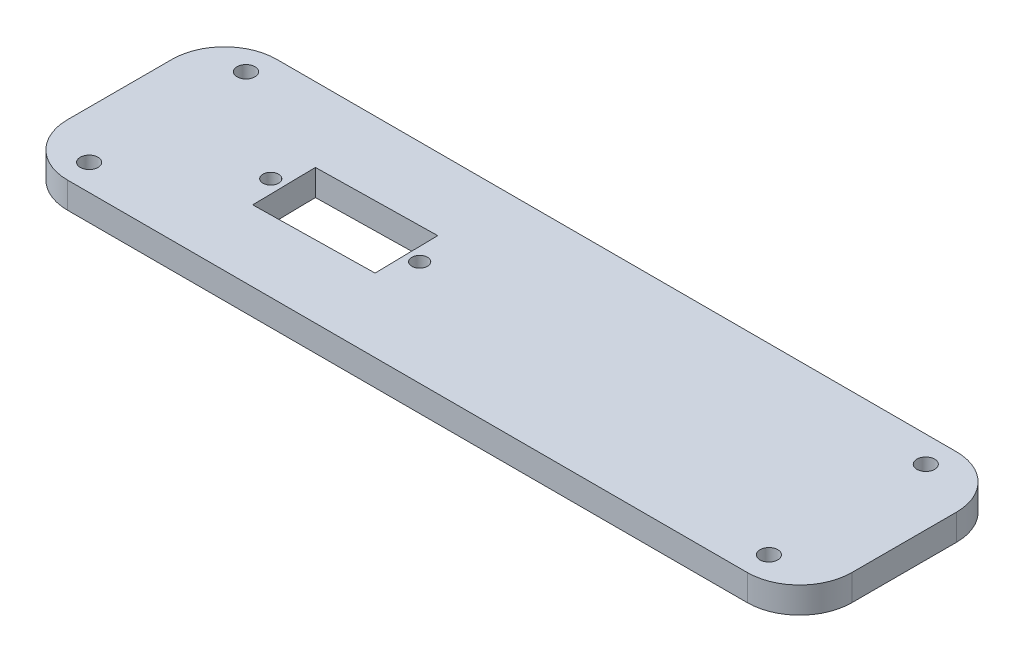
ISO-10303-21;
HEADER;
FILE_DESCRIPTION(('STEP AP214'),'2;1');
FILE_NAME('part.step','',(''),(''),'','','');
FILE_SCHEMA(('AUTOMOTIVE_DESIGN { 1 0 10303 214 1 1 1 1 }'));
ENDSEC;
DATA;
#1=APPLICATION_CONTEXT('core data for automotive mechanical design processes');
#2=APPLICATION_PROTOCOL_DEFINITION('international standard','automotive_design',2000,#1);
#3=PRODUCT_CONTEXT('',#1,'mechanical');
#4=PRODUCT('Part','Part','',(#3));
#5=PRODUCT_RELATED_PRODUCT_CATEGORY('part','',(#4));
#6=PRODUCT_DEFINITION_FORMATION('','',#4);
#7=PRODUCT_DEFINITION_CONTEXT('part definition',#1,'design');
#8=PRODUCT_DEFINITION('design','',#6,#7);
#9=PRODUCT_DEFINITION_SHAPE('','',#8);
#10=(LENGTH_UNIT() NAMED_UNIT(*) SI_UNIT(.MILLI.,.METRE.));
#11=(NAMED_UNIT(*) PLANE_ANGLE_UNIT() SI_UNIT($,.RADIAN.));
#12=(NAMED_UNIT(*) SI_UNIT($,.STERADIAN.) SOLID_ANGLE_UNIT());
#13=UNCERTAINTY_MEASURE_WITH_UNIT(LENGTH_MEASURE(1.E-05),#10,'distance_accuracy_value','');
#14=(GEOMETRIC_REPRESENTATION_CONTEXT(3) GLOBAL_UNCERTAINTY_ASSIGNED_CONTEXT((#13)) GLOBAL_UNIT_ASSIGNED_CONTEXT((#10,
#11,#12)) REPRESENTATION_CONTEXT('',''));
#15=CARTESIAN_POINT('',(0.,0.,0.));
#16=DIRECTION('',(0.,0.,1.));
#17=DIRECTION('',(1.,0.,0.));
#18=AXIS2_PLACEMENT_3D('',#15,#16,#17);
#19=CARTESIAN_POINT('',(100.867654831489,5.,-20.));
#20=DIRECTION('',(-1.,0.,0.));
#21=DIRECTION('',(0.,0.,1.));
#22=AXIS2_PLACEMENT_3D('',#19,#20,#21);
#23=PLANE('',#22);
#24=DIRECTION('',(0.,0.,-1.));
#25=VECTOR('',#24,1.);
#26=CARTESIAN_POINT('',(100.867654831489,5.,-20.));
#27=LINE('',#26,#25);
#28=CARTESIAN_POINT('',(100.867654831489,5.,9.99999999999999));
#29=VERTEX_POINT('',#28);
#30=CARTESIAN_POINT('',(100.867654831489,5.,-10.));
#31=VERTEX_POINT('',#30);
#32=EDGE_CURVE('E186',#29,#31,#27,.T.);
#33=ORIENTED_EDGE('',*,*,#32,.F.);
#34=DIRECTION('',(0.,-1.,0.));
#35=VECTOR('',#34,1.);
#36=CARTESIAN_POINT('',(100.867654831489,5.,9.99999999999999));
#37=LINE('',#36,#35);
#38=CARTESIAN_POINT('',(100.867654831489,0.,9.99999999999999));
#39=VERTEX_POINT('',#38);
#40=EDGE_CURVE('E211',#29,#39,#37,.T.);
#41=ORIENTED_EDGE('',*,*,#40,.T.);
#42=DIRECTION('',(0.,0.,-1.));
#43=VECTOR('',#42,1.);
#44=CARTESIAN_POINT('',(100.867654831489,0.,-20.));
#45=LINE('',#44,#43);
#46=CARTESIAN_POINT('',(100.867654831489,0.,-10.));
#47=VERTEX_POINT('',#46);
#48=EDGE_CURVE('E183',#39,#47,#45,.T.);
#49=ORIENTED_EDGE('',*,*,#48,.T.);
#50=DIRECTION('',(0.,-1.,0.));
#51=VECTOR('',#50,1.);
#52=CARTESIAN_POINT('',(100.867654831489,5.,-10.));
#53=LINE('',#52,#51);
#54=EDGE_CURVE('E199',#47,#31,#53,.F.);
#55=ORIENTED_EDGE('',*,*,#54,.T.);
#56=EDGE_LOOP('',(#33,#41,#49,#55));
#57=FACE_BOUND('',#56,.T.);
#58=ADVANCED_FACE('F33',(#57),#23,.F.);
#59=CARTESIAN_POINT('',(-49.1323451685113,5.,-20.));
#60=DIRECTION('',(0.,0.,1.));
#61=DIRECTION('',(1.,0.,0.));
#62=AXIS2_PLACEMENT_3D('',#59,#60,#61);
#63=PLANE('',#62);
#64=DIRECTION('',(-1.,0.,0.));
#65=VECTOR('',#64,1.);
#66=CARTESIAN_POINT('',(-49.1323451685113,0.,-20.));
#67=LINE('',#66,#65);
#68=CARTESIAN_POINT('',(90.8676548314887,0.,-20.));
#69=VERTEX_POINT('',#68);
#70=CARTESIAN_POINT('',(-39.1323451685113,0.,-20.));
#71=VERTEX_POINT('',#70);
#72=EDGE_CURVE('E202',#69,#71,#67,.T.);
#73=ORIENTED_EDGE('',*,*,#72,.T.);
#74=DIRECTION('',(0.,-1.,0.));
#75=VECTOR('',#74,1.);
#76=CARTESIAN_POINT('',(-39.1323451685113,5.,-20.));
#77=LINE('',#76,#75);
#78=CARTESIAN_POINT('',(-39.1323451685113,5.,-20.));
#79=VERTEX_POINT('',#78);
#80=EDGE_CURVE('E11',#71,#79,#77,.F.);
#81=ORIENTED_EDGE('',*,*,#80,.T.);
#82=DIRECTION('',(-1.,0.,0.));
#83=VECTOR('',#82,1.);
#84=CARTESIAN_POINT('',(-49.1323451685113,5.,-20.));
#85=LINE('',#84,#83);
#86=CARTESIAN_POINT('',(90.8676548314887,5.,-20.));
#87=VERTEX_POINT('',#86);
#88=EDGE_CURVE('E189',#87,#79,#85,.T.);
#89=ORIENTED_EDGE('',*,*,#88,.F.);
#90=DIRECTION('',(0.,-1.,0.));
#91=VECTOR('',#90,1.);
#92=CARTESIAN_POINT('',(90.8676548314887,5.,-20.));
#93=LINE('',#92,#91);
#94=EDGE_CURVE('E41',#87,#69,#93,.T.);
#95=ORIENTED_EDGE('',*,*,#94,.T.);
#96=EDGE_LOOP('',(#73,#81,#89,#95));
#97=FACE_BOUND('',#96,.T.);
#98=ADVANCED_FACE('F244',(#97),#63,.F.);
#99=CARTESIAN_POINT('',(-49.1323451685113,5.,-20.));
#100=DIRECTION('',(1.,0.,0.));
#101=DIRECTION('',(0.,0.,-1.));
#102=AXIS2_PLACEMENT_3D('',#99,#100,#101);
#103=PLANE('',#102);
#104=DIRECTION('',(0.,0.,1.));
#105=VECTOR('',#104,1.);
#106=CARTESIAN_POINT('',(-49.1323451685113,0.,-20.));
#107=LINE('',#106,#105);
#108=CARTESIAN_POINT('',(-49.1323451685113,0.,-10.));
#109=VERTEX_POINT('',#108);
#110=CARTESIAN_POINT('',(-49.1323451685113,0.,10.));
#111=VERTEX_POINT('',#110);
#112=EDGE_CURVE('E205',#109,#111,#107,.T.);
#113=ORIENTED_EDGE('',*,*,#112,.T.);
#114=DIRECTION('',(0.,-1.,0.));
#115=VECTOR('',#114,1.);
#116=CARTESIAN_POINT('',(-49.1323451685113,5.,10.));
#117=LINE('',#116,#115);
#118=CARTESIAN_POINT('',(-49.1323451685113,5.,10.));
#119=VERTEX_POINT('',#118);
#120=EDGE_CURVE('E238',#111,#119,#117,.F.);
#121=ORIENTED_EDGE('',*,*,#120,.T.);
#122=DIRECTION('',(0.,0.,1.));
#123=VECTOR('',#122,1.);
#124=CARTESIAN_POINT('',(-49.1323451685113,5.,-20.));
#125=LINE('',#124,#123);
#126=CARTESIAN_POINT('',(-49.1323451685113,5.,-10.));
#127=VERTEX_POINT('',#126);
#128=EDGE_CURVE('E193',#127,#119,#125,.T.);
#129=ORIENTED_EDGE('',*,*,#128,.F.);
#130=DIRECTION('',(0.,-1.,0.));
#131=VECTOR('',#130,1.);
#132=CARTESIAN_POINT('',(-49.1323451685113,5.,-10.));
#133=LINE('',#132,#131);
#134=EDGE_CURVE('E235',#127,#109,#133,.T.);
#135=ORIENTED_EDGE('',*,*,#134,.T.);
#136=EDGE_LOOP('',(#113,#121,#129,#135));
#137=FACE_BOUND('',#136,.T.);
#138=ADVANCED_FACE('F258',(#137),#103,.F.);
#139=CARTESIAN_POINT('',(-49.1323451685113,5.,20.));
#140=DIRECTION('',(0.,0.,-1.));
#141=DIRECTION('',(-1.,0.,0.));
#142=AXIS2_PLACEMENT_3D('',#139,#140,#141);
#143=PLANE('',#142);
#144=DIRECTION('',(1.,0.,0.));
#145=VECTOR('',#144,1.);
#146=CARTESIAN_POINT('',(-49.1323451685113,0.,20.));
#147=LINE('',#146,#145);
#148=CARTESIAN_POINT('',(-39.1323451685113,0.,20.));
#149=VERTEX_POINT('',#148);
#150=CARTESIAN_POINT('',(90.8676548314887,0.,20.));
#151=VERTEX_POINT('',#150);
#152=EDGE_CURVE('E190',#149,#151,#147,.T.);
#153=ORIENTED_EDGE('',*,*,#152,.T.);
#154=DIRECTION('',(0.,-1.,0.));
#155=VECTOR('',#154,1.);
#156=CARTESIAN_POINT('',(90.8676548314887,5.,20.));
#157=LINE('',#156,#155);
#158=CARTESIAN_POINT('',(90.8676548314887,5.,20.));
#159=VERTEX_POINT('',#158);
#160=EDGE_CURVE('E225',#151,#159,#157,.F.);
#161=ORIENTED_EDGE('',*,*,#160,.T.);
#162=DIRECTION('',(1.,0.,0.));
#163=VECTOR('',#162,1.);
#164=CARTESIAN_POINT('',(-49.1323451685113,5.,20.));
#165=LINE('',#164,#163);
#166=CARTESIAN_POINT('',(-39.1323451685113,5.,20.));
#167=VERTEX_POINT('',#166);
#168=EDGE_CURVE('E196',#167,#159,#165,.T.);
#169=ORIENTED_EDGE('',*,*,#168,.F.);
#170=DIRECTION('',(0.,-1.,0.));
#171=VECTOR('',#170,1.);
#172=CARTESIAN_POINT('',(-39.1323451685113,5.,20.));
#173=LINE('',#172,#171);
#174=EDGE_CURVE('E222',#167,#149,#173,.T.);
#175=ORIENTED_EDGE('',*,*,#174,.T.);
#176=EDGE_LOOP('',(#153,#161,#169,#175));
#177=FACE_BOUND('',#176,.T.);
#178=ADVANCED_FACE('F268',(#177),#143,.F.);
#179=CARTESIAN_POINT('',(0.,5.,0.));
#180=DIRECTION('',(0.,1.,0.));
#181=DIRECTION('',(0.,0.,1.));
#182=AXIS2_PLACEMENT_3D('',#179,#180,#181);
#183=PLANE('',#182);
#184=CARTESIAN_POINT('',(8.07380427770074,5.,-0.138958576433314));
#185=DIRECTION('',(0.,-1.,0.));
#186=DIRECTION('',(0.,0.,-1.));
#187=AXIS2_PLACEMENT_3D('',#184,#185,#186);
#188=CIRCLE('',#187,1.5);
#189=CARTESIAN_POINT('',(8.07380427770074,5.,-1.63895857643331));
#190=VERTEX_POINT('',#189);
#191=EDGE_CURVE('E179',#190,#190,#188,.T.);
#192=ORIENTED_EDGE('',*,*,#191,.T.);
#193=EDGE_LOOP('',(#192));
#194=FACE_BOUND('',#193,.T.);
#195=CARTESIAN_POINT('',(-19.9220495643543,5.,0.342879211925358));
#196=DIRECTION('',(0.,-1.,0.));
#197=DIRECTION('',(0.,0.,-1.));
#198=AXIS2_PLACEMENT_3D('',#195,#196,#197);
#199=CIRCLE('',#198,1.5);
#200=CARTESIAN_POINT('',(-19.9220495643543,5.,-1.15712078807464));
#201=VERTEX_POINT('',#200);
#202=EDGE_CURVE('E477',#201,#201,#199,.T.);
#203=ORIENTED_EDGE('',*,*,#202,.T.);
#204=EDGE_LOOP('',(#203));
#205=FACE_BOUND('',#204,.T.);
#206=DIRECTION('',(0.999851922930538,0.,-0.0172084924413811));
#207=VECTOR('',#206,1.);
#208=CARTESIAN_POINT('',(5.46920266648203,5.,-6.19503407520608));
#209=LINE('',#208,#207);
#210=CARTESIAN_POINT('',(-17.5273915609203,5.,-5.79923874905432));
#211=VERTEX_POINT('',#210);
#212=CARTESIAN_POINT('',(5.46920266648203,5.,-6.19503407520608));
#213=VERTEX_POINT('',#212);
#214=EDGE_CURVE('E123',#211,#213,#209,.T.);
#215=ORIENTED_EDGE('',*,*,#214,.T.);
#216=DIRECTION('',(0.0172084924413812,0.,0.999851922930538));
#217=VECTOR('',#216,1.);
#218=CARTESIAN_POINT('',(5.67914627426688,5.,6.00315938454648));
#219=LINE('',#218,#217);
#220=CARTESIAN_POINT('',(5.67914627426688,5.,6.00315938454648));
#221=VERTEX_POINT('',#220);
#222=EDGE_CURVE('E132',#213,#221,#219,.T.);
#223=ORIENTED_EDGE('',*,*,#222,.T.);
#224=DIRECTION('',(-0.999851922930538,0.,0.0172084924413811));
#225=VECTOR('',#224,1.);
#226=CARTESIAN_POINT('',(-17.3174479531355,5.,6.39895471069825));
#227=LINE('',#226,#225);
#228=CARTESIAN_POINT('',(-17.3174479531355,5.,6.39895471069825));
#229=VERTEX_POINT('',#228);
#230=EDGE_CURVE('E48',#221,#229,#227,.T.);
#231=ORIENTED_EDGE('',*,*,#230,.T.);
#232=DIRECTION('',(-0.0172084924413809,0.,-0.999851922930538));
#233=VECTOR('',#232,1.);
#234=CARTESIAN_POINT('',(-17.5273915609203,5.,-5.79923874905432));
#235=LINE('',#234,#233);
#236=EDGE_CURVE('E129',#229,#211,#235,.T.);
#237=ORIENTED_EDGE('',*,*,#236,.T.);
#238=EDGE_LOOP('',(#215,#223,#231,#237));
#239=FACE_BOUND('',#238,.T.);
#240=CARTESIAN_POINT('',(-40.,5.,15.));
#241=DIRECTION('',(0.,1.,0.));
#242=DIRECTION('',(0.,0.,1.));
#243=AXIS2_PLACEMENT_3D('',#240,#241,#242);
#244=CIRCLE('',#243,1.7);
#245=CARTESIAN_POINT('',(-40.,5.,16.7));
#246=VERTEX_POINT('',#245);
#247=EDGE_CURVE('E176',#246,#246,#244,.T.);
#248=ORIENTED_EDGE('',*,*,#247,.F.);
#249=EDGE_LOOP('',(#248));
#250=FACE_BOUND('',#249,.T.);
#251=CARTESIAN_POINT('',(90.,5.,15.));
#252=DIRECTION('',(0.,1.,0.));
#253=DIRECTION('',(0.,0.,1.));
#254=AXIS2_PLACEMENT_3D('',#251,#252,#253);
#255=CIRCLE('',#254,1.7);
#256=CARTESIAN_POINT('',(90.,5.,16.7));
#257=VERTEX_POINT('',#256);
#258=EDGE_CURVE('E170',#257,#257,#255,.T.);
#259=ORIENTED_EDGE('',*,*,#258,.F.);
#260=EDGE_LOOP('',(#259));
#261=FACE_BOUND('',#260,.T.);
#262=CARTESIAN_POINT('',(90.,5.,-15.));
#263=DIRECTION('',(0.,1.,0.));
#264=DIRECTION('',(0.,0.,1.));
#265=AXIS2_PLACEMENT_3D('',#262,#263,#264);
#266=CIRCLE('',#265,1.7);
#267=CARTESIAN_POINT('',(90.,5.,-13.3));
#268=VERTEX_POINT('',#267);
#269=EDGE_CURVE('E164',#268,#268,#266,.T.);
#270=ORIENTED_EDGE('',*,*,#269,.F.);
#271=EDGE_LOOP('',(#270));
#272=FACE_BOUND('',#271,.T.);
#273=CARTESIAN_POINT('',(-40.,5.,-15.));
#274=DIRECTION('',(0.,1.,0.));
#275=DIRECTION('',(0.,0.,1.));
#276=AXIS2_PLACEMENT_3D('',#273,#274,#275);
#277=CIRCLE('',#276,1.7);
#278=CARTESIAN_POINT('',(-40.,5.,-13.3));
#279=VERTEX_POINT('',#278);
#280=EDGE_CURVE('E163',#279,#279,#277,.T.);
#281=ORIENTED_EDGE('',*,*,#280,.F.);
#282=EDGE_LOOP('',(#281));
#283=FACE_BOUND('',#282,.T.);
#284=ORIENTED_EDGE('',*,*,#168,.T.);
#285=CARTESIAN_POINT('',(90.8676548314887,5.,9.99999999999999));
#286=DIRECTION('',(0.,1.,0.));
#287=DIRECTION('',(0.,0.,1.));
#288=AXIS2_PLACEMENT_3D('',#285,#286,#287);
#289=CIRCLE('',#288,10.);
#290=EDGE_CURVE('E233',#159,#29,#289,.T.);
#291=ORIENTED_EDGE('',*,*,#290,.T.);
#292=ORIENTED_EDGE('',*,*,#32,.T.);
#293=CARTESIAN_POINT('',(90.8676548314887,5.,-10.));
#294=DIRECTION('',(0.,1.,0.));
#295=DIRECTION('',(0.,0.,1.));
#296=AXIS2_PLACEMENT_3D('',#293,#294,#295);
#297=CIRCLE('',#296,10.);
#298=EDGE_CURVE('E227',#31,#87,#297,.T.);
#299=ORIENTED_EDGE('',*,*,#298,.T.);
#300=ORIENTED_EDGE('',*,*,#88,.T.);
#301=CARTESIAN_POINT('',(-39.1323451685113,5.,-10.));
#302=DIRECTION('',(0.,1.,0.));
#303=DIRECTION('',(0.,0.,1.));
#304=AXIS2_PLACEMENT_3D('',#301,#302,#303);
#305=CIRCLE('',#304,10.);
#306=EDGE_CURVE('E229',#79,#127,#305,.T.);
#307=ORIENTED_EDGE('',*,*,#306,.T.);
#308=ORIENTED_EDGE('',*,*,#128,.T.);
#309=CARTESIAN_POINT('',(-39.1323451685113,5.,10.));
#310=DIRECTION('',(0.,1.,0.));
#311=DIRECTION('',(0.,0.,1.));
#312=AXIS2_PLACEMENT_3D('',#309,#310,#311);
#313=CIRCLE('',#312,10.);
#314=EDGE_CURVE('E231',#119,#167,#313,.T.);
#315=ORIENTED_EDGE('',*,*,#314,.T.);
#316=EDGE_LOOP('',(#284,#291,#292,#299,#300,#307,#308,#315));
#317=FACE_BOUND('',#316,.T.);
#318=ADVANCED_FACE('F136',(#194,#205,#239,#250,#261,#272,#283,#317),#183,.T.);
#319=CARTESIAN_POINT('',(0.,0.,0.));
#320=DIRECTION('',(0.,1.,0.));
#321=DIRECTION('',(0.,0.,1.));
#322=AXIS2_PLACEMENT_3D('',#319,#320,#321);
#323=PLANE('',#322);
#324=CARTESIAN_POINT('',(8.07380427770074,0.,-0.138958576433314));
#325=DIRECTION('',(0.,-1.,0.));
#326=DIRECTION('',(0.,0.,-1.));
#327=AXIS2_PLACEMENT_3D('',#324,#325,#326);
#328=CIRCLE('',#327,1.5);
#329=CARTESIAN_POINT('',(8.07380427770074,0.,-1.63895857643331));
#330=VERTEX_POINT('',#329);
#331=EDGE_CURVE('E476',#330,#330,#328,.T.);
#332=ORIENTED_EDGE('',*,*,#331,.F.);
#333=EDGE_LOOP('',(#332));
#334=FACE_BOUND('',#333,.T.);
#335=CARTESIAN_POINT('',(-19.9220495643543,0.,0.342879211925358));
#336=DIRECTION('',(0.,-1.,0.));
#337=DIRECTION('',(0.,0.,-1.));
#338=AXIS2_PLACEMENT_3D('',#335,#336,#337);
#339=CIRCLE('',#338,1.5);
#340=CARTESIAN_POINT('',(-19.9220495643543,0.,-1.15712078807464));
#341=VERTEX_POINT('',#340);
#342=EDGE_CURVE('E145',#341,#341,#339,.T.);
#343=ORIENTED_EDGE('',*,*,#342,.F.);
#344=EDGE_LOOP('',(#343));
#345=FACE_BOUND('',#344,.T.);
#346=DIRECTION('',(0.0172084924413812,0.,0.999851922930538));
#347=VECTOR('',#346,1.);
#348=CARTESIAN_POINT('',(5.67914627426688,0.,6.00315938454648));
#349=LINE('',#348,#347);
#350=CARTESIAN_POINT('',(5.46920266648203,0.,-6.19503407520608));
#351=VERTEX_POINT('',#350);
#352=CARTESIAN_POINT('',(5.67914627426688,0.,6.00315938454648));
#353=VERTEX_POINT('',#352);
#354=EDGE_CURVE('E151',#351,#353,#349,.T.);
#355=ORIENTED_EDGE('',*,*,#354,.F.);
#356=DIRECTION('',(0.999851922930538,0.,-0.0172084924413811));
#357=VECTOR('',#356,1.);
#358=CARTESIAN_POINT('',(5.46920266648203,0.,-6.19503407520608));
#359=LINE('',#358,#357);
#360=CARTESIAN_POINT('',(-17.5273915609203,0.,-5.79923874905432));
#361=VERTEX_POINT('',#360);
#362=EDGE_CURVE('E56',#361,#351,#359,.T.);
#363=ORIENTED_EDGE('',*,*,#362,.F.);
#364=DIRECTION('',(-0.0172084924413809,0.,-0.999851922930538));
#365=VECTOR('',#364,1.);
#366=CARTESIAN_POINT('',(-17.5273915609203,0.,-5.79923874905432));
#367=LINE('',#366,#365);
#368=CARTESIAN_POINT('',(-17.3174479531355,0.,6.39895471069825));
#369=VERTEX_POINT('',#368);
#370=EDGE_CURVE('E139',#369,#361,#367,.T.);
#371=ORIENTED_EDGE('',*,*,#370,.F.);
#372=DIRECTION('',(-0.999851922930538,0.,0.0172084924413811));
#373=VECTOR('',#372,1.);
#374=CARTESIAN_POINT('',(-17.3174479531355,0.,6.39895471069825));
#375=LINE('',#374,#373);
#376=EDGE_CURVE('E142',#353,#369,#375,.T.);
#377=ORIENTED_EDGE('',*,*,#376,.F.);
#378=EDGE_LOOP('',(#355,#363,#371,#377));
#379=FACE_BOUND('',#378,.T.);
#380=CARTESIAN_POINT('',(-40.,0.,15.));
#381=DIRECTION('',(0.,1.,0.));
#382=DIRECTION('',(0.,0.,1.));
#383=AXIS2_PLACEMENT_3D('',#380,#381,#382);
#384=CIRCLE('',#383,1.7);
#385=CARTESIAN_POINT('',(-40.,0.,16.7));
#386=VERTEX_POINT('',#385);
#387=EDGE_CURVE('E173',#386,#386,#384,.T.);
#388=ORIENTED_EDGE('',*,*,#387,.T.);
#389=EDGE_LOOP('',(#388));
#390=FACE_BOUND('',#389,.T.);
#391=CARTESIAN_POINT('',(90.,0.,15.));
#392=DIRECTION('',(0.,1.,0.));
#393=DIRECTION('',(0.,0.,1.));
#394=AXIS2_PLACEMENT_3D('',#391,#392,#393);
#395=CIRCLE('',#394,1.7);
#396=CARTESIAN_POINT('',(90.,0.,16.7));
#397=VERTEX_POINT('',#396);
#398=EDGE_CURVE('E167',#397,#397,#395,.T.);
#399=ORIENTED_EDGE('',*,*,#398,.T.);
#400=EDGE_LOOP('',(#399));
#401=FACE_BOUND('',#400,.T.);
#402=CARTESIAN_POINT('',(90.,0.,-15.));
#403=DIRECTION('',(0.,1.,0.));
#404=DIRECTION('',(0.,0.,1.));
#405=AXIS2_PLACEMENT_3D('',#402,#403,#404);
#406=CIRCLE('',#405,1.7);
#407=CARTESIAN_POINT('',(90.,0.,-13.3));
#408=VERTEX_POINT('',#407);
#409=EDGE_CURVE('E160',#408,#408,#406,.T.);
#410=ORIENTED_EDGE('',*,*,#409,.T.);
#411=EDGE_LOOP('',(#410));
#412=FACE_BOUND('',#411,.T.);
#413=CARTESIAN_POINT('',(-40.,0.,-15.));
#414=DIRECTION('',(0.,1.,0.));
#415=DIRECTION('',(0.,0.,1.));
#416=AXIS2_PLACEMENT_3D('',#413,#414,#415);
#417=CIRCLE('',#416,1.7);
#418=CARTESIAN_POINT('',(-40.,0.,-13.3));
#419=VERTEX_POINT('',#418);
#420=EDGE_CURVE('E180',#419,#419,#417,.T.);
#421=ORIENTED_EDGE('',*,*,#420,.T.);
#422=EDGE_LOOP('',(#421));
#423=FACE_BOUND('',#422,.T.);
#424=ORIENTED_EDGE('',*,*,#48,.F.);
#425=CARTESIAN_POINT('',(90.8676548314887,0.,9.99999999999999));
#426=DIRECTION('',(0.,1.,0.));
#427=DIRECTION('',(0.,0.,1.));
#428=AXIS2_PLACEMENT_3D('',#425,#426,#427);
#429=CIRCLE('',#428,10.);
#430=EDGE_CURVE('E220',#39,#151,#429,.F.);
#431=ORIENTED_EDGE('',*,*,#430,.T.);
#432=ORIENTED_EDGE('',*,*,#152,.F.);
#433=CARTESIAN_POINT('',(-39.1323451685113,0.,10.));
#434=DIRECTION('',(0.,1.,0.));
#435=DIRECTION('',(0.,0.,1.));
#436=AXIS2_PLACEMENT_3D('',#433,#434,#435);
#437=CIRCLE('',#436,10.);
#438=EDGE_CURVE('E218',#149,#111,#437,.F.);
#439=ORIENTED_EDGE('',*,*,#438,.T.);
#440=ORIENTED_EDGE('',*,*,#112,.F.);
#441=CARTESIAN_POINT('',(-39.1323451685113,0.,-10.));
#442=DIRECTION('',(0.,1.,0.));
#443=DIRECTION('',(0.,0.,1.));
#444=AXIS2_PLACEMENT_3D('',#441,#442,#443);
#445=CIRCLE('',#444,10.);
#446=EDGE_CURVE('E216',#109,#71,#445,.F.);
#447=ORIENTED_EDGE('',*,*,#446,.T.);
#448=ORIENTED_EDGE('',*,*,#72,.F.);
#449=CARTESIAN_POINT('',(90.8676548314887,0.,-10.));
#450=DIRECTION('',(0.,1.,0.));
#451=DIRECTION('',(0.,0.,1.));
#452=AXIS2_PLACEMENT_3D('',#449,#450,#451);
#453=CIRCLE('',#452,10.);
#454=EDGE_CURVE('E214',#69,#47,#453,.F.);
#455=ORIENTED_EDGE('',*,*,#454,.T.);
#456=EDGE_LOOP('',(#424,#431,#432,#439,#440,#447,#448,#455));
#457=FACE_BOUND('',#456,.T.);
#458=ADVANCED_FACE('F250',(#334,#345,#379,#390,#401,#412,#423,#457),#323,.F.);
#459=CARTESIAN_POINT('',(-40.,0.,-15.));
#460=DIRECTION('',(0.,1.,0.));
#461=DIRECTION('',(0.,0.,1.));
#462=AXIS2_PLACEMENT_3D('',#459,#460,#461);
#463=CYLINDRICAL_SURFACE('',#462,1.7);
#464=ORIENTED_EDGE('',*,*,#420,.F.);
#465=EDGE_LOOP('',(#464));
#466=FACE_BOUND('',#465,.T.);
#467=ORIENTED_EDGE('',*,*,#280,.T.);
#468=EDGE_LOOP('',(#467));
#469=FACE_BOUND('',#468,.T.);
#470=ADVANCED_FACE('F330',(#466,#469),#463,.F.);
#471=CARTESIAN_POINT('',(90.,0.,-15.));
#472=DIRECTION('',(0.,1.,0.));
#473=DIRECTION('',(0.,0.,1.));
#474=AXIS2_PLACEMENT_3D('',#471,#472,#473);
#475=CYLINDRICAL_SURFACE('',#474,1.7);
#476=ORIENTED_EDGE('',*,*,#409,.F.);
#477=EDGE_LOOP('',(#476));
#478=FACE_BOUND('',#477,.T.);
#479=ORIENTED_EDGE('',*,*,#269,.T.);
#480=EDGE_LOOP('',(#479));
#481=FACE_BOUND('',#480,.T.);
#482=ADVANCED_FACE('F391',(#478,#481),#475,.F.);
#483=CARTESIAN_POINT('',(90.,0.,15.));
#484=DIRECTION('',(0.,1.,0.));
#485=DIRECTION('',(0.,0.,1.));
#486=AXIS2_PLACEMENT_3D('',#483,#484,#485);
#487=CYLINDRICAL_SURFACE('',#486,1.7);
#488=ORIENTED_EDGE('',*,*,#398,.F.);
#489=EDGE_LOOP('',(#488));
#490=FACE_BOUND('',#489,.T.);
#491=ORIENTED_EDGE('',*,*,#258,.T.);
#492=EDGE_LOOP('',(#491));
#493=FACE_BOUND('',#492,.T.);
#494=ADVANCED_FACE('F394',(#490,#493),#487,.F.);
#495=CARTESIAN_POINT('',(-40.,0.,15.));
#496=DIRECTION('',(0.,1.,0.));
#497=DIRECTION('',(0.,0.,1.));
#498=AXIS2_PLACEMENT_3D('',#495,#496,#497);
#499=CYLINDRICAL_SURFACE('',#498,1.7);
#500=ORIENTED_EDGE('',*,*,#387,.F.);
#501=EDGE_LOOP('',(#500));
#502=FACE_BOUND('',#501,.T.);
#503=ORIENTED_EDGE('',*,*,#247,.T.);
#504=EDGE_LOOP('',(#503));
#505=FACE_BOUND('',#504,.T.);
#506=ADVANCED_FACE('F294',(#502,#505),#499,.F.);
#507=CARTESIAN_POINT('',(90.8676548314887,5.,9.99999999999999));
#508=DIRECTION('',(0.,-1.,0.));
#509=DIRECTION('',(0.,0.,-1.));
#510=AXIS2_PLACEMENT_3D('',#507,#508,#509);
#511=CYLINDRICAL_SURFACE('',#510,10.);
#512=ORIENTED_EDGE('',*,*,#290,.F.);
#513=ORIENTED_EDGE('',*,*,#160,.F.);
#514=ORIENTED_EDGE('',*,*,#430,.F.);
#515=ORIENTED_EDGE('',*,*,#40,.F.);
#516=EDGE_LOOP('',(#512,#513,#514,#515));
#517=FACE_BOUND('',#516,.T.);
#518=ADVANCED_FACE('F273',(#517),#511,.T.);
#519=CARTESIAN_POINT('',(-39.1323451685113,5.,10.));
#520=DIRECTION('',(0.,-1.,0.));
#521=DIRECTION('',(0.,0.,-1.));
#522=AXIS2_PLACEMENT_3D('',#519,#520,#521);
#523=CYLINDRICAL_SURFACE('',#522,10.);
#524=ORIENTED_EDGE('',*,*,#314,.F.);
#525=ORIENTED_EDGE('',*,*,#120,.F.);
#526=ORIENTED_EDGE('',*,*,#438,.F.);
#527=ORIENTED_EDGE('',*,*,#174,.F.);
#528=EDGE_LOOP('',(#524,#525,#526,#527));
#529=FACE_BOUND('',#528,.T.);
#530=ADVANCED_FACE('F265',(#529),#523,.T.);
#531=CARTESIAN_POINT('',(-39.1323451685113,5.,-10.));
#532=DIRECTION('',(0.,-1.,0.));
#533=DIRECTION('',(0.,0.,-1.));
#534=AXIS2_PLACEMENT_3D('',#531,#532,#533);
#535=CYLINDRICAL_SURFACE('',#534,10.);
#536=ORIENTED_EDGE('',*,*,#306,.F.);
#537=ORIENTED_EDGE('',*,*,#80,.F.);
#538=ORIENTED_EDGE('',*,*,#446,.F.);
#539=ORIENTED_EDGE('',*,*,#134,.F.);
#540=EDGE_LOOP('',(#536,#537,#538,#539));
#541=FACE_BOUND('',#540,.T.);
#542=ADVANCED_FACE('F255',(#541),#535,.T.);
#543=CARTESIAN_POINT('',(90.8676548314887,5.,-10.));
#544=DIRECTION('',(0.,-1.,0.));
#545=DIRECTION('',(0.,0.,-1.));
#546=AXIS2_PLACEMENT_3D('',#543,#544,#545);
#547=CYLINDRICAL_SURFACE('',#546,10.);
#548=ORIENTED_EDGE('',*,*,#298,.F.);
#549=ORIENTED_EDGE('',*,*,#54,.F.);
#550=ORIENTED_EDGE('',*,*,#454,.F.);
#551=ORIENTED_EDGE('',*,*,#94,.F.);
#552=EDGE_LOOP('',(#548,#549,#550,#551));
#553=FACE_BOUND('',#552,.T.);
#554=ADVANCED_FACE('F35',(#553),#547,.T.);
#555=CARTESIAN_POINT('',(5.46920266648203,5.,-6.19503407520608));
#556=DIRECTION('',(-0.0172084924413811,0.,-0.999851922930538));
#557=DIRECTION('',(-0.999851922930538,0.,0.0172084924413811));
#558=AXIS2_PLACEMENT_3D('',#555,#556,#557);
#559=PLANE('',#558);
#560=ORIENTED_EDGE('',*,*,#362,.T.);
#561=DIRECTION('',(0.,-1.,0.));
#562=VECTOR('',#561,1.);
#563=CARTESIAN_POINT('',(5.46920266648203,5.,-6.19503407520608));
#564=LINE('',#563,#562);
#565=EDGE_CURVE('E119',#213,#351,#564,.T.);
#566=ORIENTED_EDGE('',*,*,#565,.F.);
#567=ORIENTED_EDGE('',*,*,#214,.F.);
#568=DIRECTION('',(0.,-1.,0.));
#569=VECTOR('',#568,1.);
#570=CARTESIAN_POINT('',(-17.5273915609203,5.,-5.79923874905432));
#571=LINE('',#570,#569);
#572=EDGE_CURVE('E155',#211,#361,#571,.T.);
#573=ORIENTED_EDGE('',*,*,#572,.T.);
#574=EDGE_LOOP('',(#560,#566,#567,#573));
#575=FACE_BOUND('',#574,.T.);
#576=ADVANCED_FACE('F121',(#575),#559,.F.);
#577=CARTESIAN_POINT('',(-17.5273915609203,5.,-5.79923874905432));
#578=DIRECTION('',(-0.999851922930538,0.,0.0172084924413809));
#579=DIRECTION('',(0.0172084924413809,0.,0.999851922930538));
#580=AXIS2_PLACEMENT_3D('',#577,#578,#579);
#581=PLANE('',#580);
#582=ORIENTED_EDGE('',*,*,#370,.T.);
#583=ORIENTED_EDGE('',*,*,#572,.F.);
#584=ORIENTED_EDGE('',*,*,#236,.F.);
#585=DIRECTION('',(0.,-1.,0.));
#586=VECTOR('',#585,1.);
#587=CARTESIAN_POINT('',(-17.3174479531355,5.,6.39895471069825));
#588=LINE('',#587,#586);
#589=EDGE_CURVE('E157',#229,#369,#588,.T.);
#590=ORIENTED_EDGE('',*,*,#589,.T.);
#591=EDGE_LOOP('',(#582,#583,#584,#590));
#592=FACE_BOUND('',#591,.T.);
#593=ADVANCED_FACE('F282',(#592),#581,.F.);
#594=CARTESIAN_POINT('',(-17.3174479531355,5.,6.39895471069825));
#595=DIRECTION('',(0.0172084924413811,0.,0.999851922930538));
#596=DIRECTION('',(0.999851922930538,0.,-0.0172084924413811));
#597=AXIS2_PLACEMENT_3D('',#594,#595,#596);
#598=PLANE('',#597);
#599=ORIENTED_EDGE('',*,*,#376,.T.);
#600=ORIENTED_EDGE('',*,*,#589,.F.);
#601=ORIENTED_EDGE('',*,*,#230,.F.);
#602=DIRECTION('',(0.,-1.,0.));
#603=VECTOR('',#602,1.);
#604=CARTESIAN_POINT('',(5.67914627426688,5.,6.00315938454648));
#605=LINE('',#604,#603);
#606=EDGE_CURVE('E128',#221,#353,#605,.T.);
#607=ORIENTED_EDGE('',*,*,#606,.T.);
#608=EDGE_LOOP('',(#599,#600,#601,#607));
#609=FACE_BOUND('',#608,.T.);
#610=ADVANCED_FACE('F347',(#609),#598,.F.);
#611=CARTESIAN_POINT('',(5.67914627426688,5.,6.00315938454648));
#612=DIRECTION('',(0.999851922930538,0.,-0.0172084924413812));
#613=DIRECTION('',(-0.0172084924413812,0.,-0.999851922930538));
#614=AXIS2_PLACEMENT_3D('',#611,#612,#613);
#615=PLANE('',#614);
#616=ORIENTED_EDGE('',*,*,#354,.T.);
#617=ORIENTED_EDGE('',*,*,#606,.F.);
#618=ORIENTED_EDGE('',*,*,#222,.F.);
#619=ORIENTED_EDGE('',*,*,#565,.T.);
#620=EDGE_LOOP('',(#616,#617,#618,#619));
#621=FACE_BOUND('',#620,.T.);
#622=ADVANCED_FACE('F133',(#621),#615,.F.);
#623=CARTESIAN_POINT('',(-19.9220495643543,5.,0.342879211925358));
#624=DIRECTION('',(0.,-1.,0.));
#625=DIRECTION('',(0.,0.,-1.));
#626=AXIS2_PLACEMENT_3D('',#623,#624,#625);
#627=CYLINDRICAL_SURFACE('',#626,1.5);
#628=ORIENTED_EDGE('',*,*,#202,.F.);
#629=EDGE_LOOP('',(#628));
#630=FACE_BOUND('',#629,.T.);
#631=ORIENTED_EDGE('',*,*,#342,.T.);
#632=EDGE_LOOP('',(#631));
#633=FACE_BOUND('',#632,.T.);
#634=ADVANCED_FACE('F365',(#630,#633),#627,.F.);
#635=CARTESIAN_POINT('',(8.07380427770074,5.,-0.138958576433314));
#636=DIRECTION('',(0.,-1.,0.));
#637=DIRECTION('',(0.,0.,-1.));
#638=AXIS2_PLACEMENT_3D('',#635,#636,#637);
#639=CYLINDRICAL_SURFACE('',#638,1.5);
#640=ORIENTED_EDGE('',*,*,#191,.F.);
#641=EDGE_LOOP('',(#640));
#642=FACE_BOUND('',#641,.T.);
#643=ORIENTED_EDGE('',*,*,#331,.T.);
#644=EDGE_LOOP('',(#643));
#645=FACE_BOUND('',#644,.T.);
#646=ADVANCED_FACE('F374',(#642,#645),#639,.F.);
#647=CLOSED_SHELL('',(#58,#98,#138,#178,#318,#458,#470,#482,#494,#506,#518,#530,#542,#554,#576,
#593,#610,#622,#634,#646));
#648=MANIFOLD_SOLID_BREP('B2',#647);
#649=ADVANCED_BREP_SHAPE_REPRESENTATION('',(#18,#648),#14);
#650=SHAPE_DEFINITION_REPRESENTATION(#9,#649);
ENDSEC;
END-ISO-10303-21;
